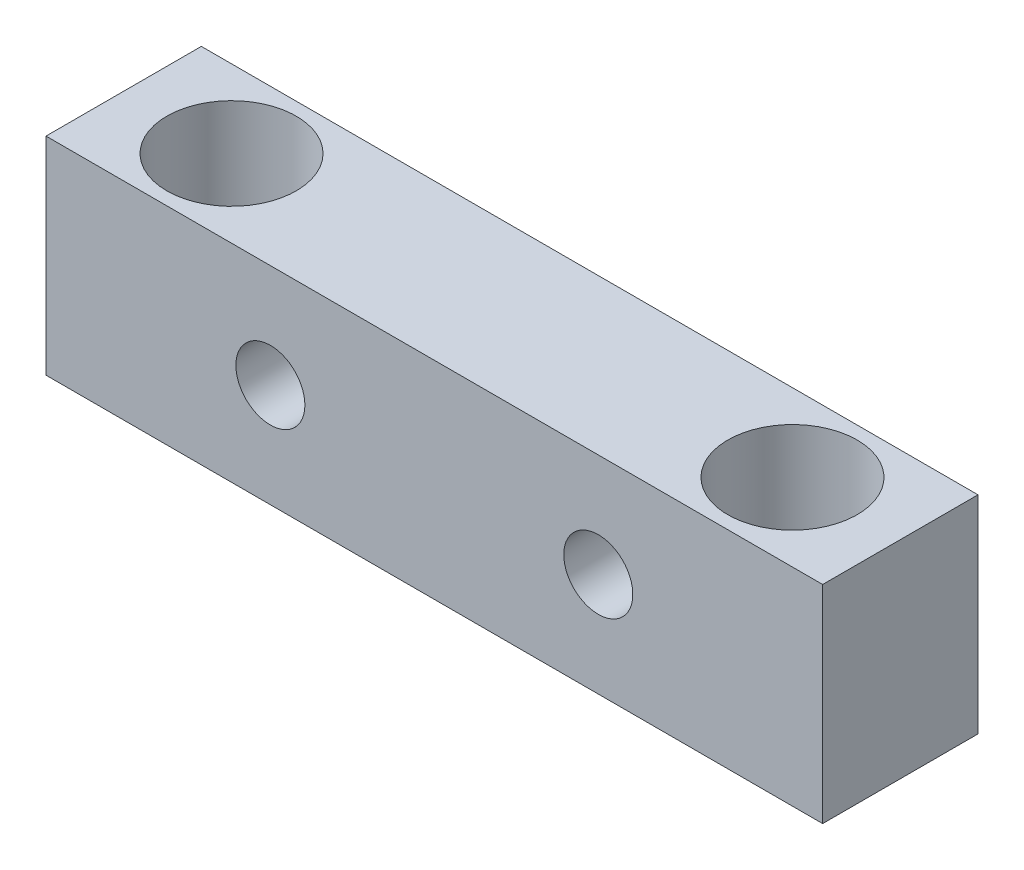
ISO-10303-21;
HEADER;
FILE_DESCRIPTION(('STEP AP214'),'2;1');
FILE_NAME('part.step','',(''),(''),'','','');
FILE_SCHEMA(('AUTOMOTIVE_DESIGN { 1 0 10303 214 1 1 1 1 }'));
ENDSEC;
DATA;
#1=APPLICATION_CONTEXT('core data for automotive mechanical design processes');
#2=APPLICATION_PROTOCOL_DEFINITION('international standard','automotive_design',2000,#1);
#3=PRODUCT_CONTEXT('',#1,'mechanical');
#4=PRODUCT('Part','Part','',(#3));
#5=PRODUCT_RELATED_PRODUCT_CATEGORY('part','',(#4));
#6=PRODUCT_DEFINITION_FORMATION('','',#4);
#7=PRODUCT_DEFINITION_CONTEXT('part definition',#1,'design');
#8=PRODUCT_DEFINITION('design','',#6,#7);
#9=PRODUCT_DEFINITION_SHAPE('','',#8);
#10=(LENGTH_UNIT() NAMED_UNIT(*) SI_UNIT(.MILLI.,.METRE.));
#11=(NAMED_UNIT(*) PLANE_ANGLE_UNIT() SI_UNIT($,.RADIAN.));
#12=(NAMED_UNIT(*) SI_UNIT($,.STERADIAN.) SOLID_ANGLE_UNIT());
#13=UNCERTAINTY_MEASURE_WITH_UNIT(LENGTH_MEASURE(1.E-05),#10,'distance_accuracy_value','');
#14=(GEOMETRIC_REPRESENTATION_CONTEXT(3) GLOBAL_UNCERTAINTY_ASSIGNED_CONTEXT((#13)) GLOBAL_UNIT_ASSIGNED_CONTEXT((#10,
#11,#12)) REPRESENTATION_CONTEXT('',''));
#15=CARTESIAN_POINT('',(0.,0.,0.));
#16=DIRECTION('',(0.,0.,1.));
#17=DIRECTION('',(1.,0.,0.));
#18=AXIS2_PLACEMENT_3D('',#15,#16,#17);
#19=CARTESIAN_POINT('',(0.,0.,9.));
#20=DIRECTION('',(0.,0.,-1.));
#21=DIRECTION('',(-1.,0.,0.));
#22=AXIS2_PLACEMENT_3D('',#19,#20,#21);
#23=PLANE('',#22);
#24=DIRECTION('',(0.,1.,0.));
#25=VECTOR('',#24,1.);
#26=CARTESIAN_POINT('',(45.,-12.,9.));
#27=LINE('',#26,#25);
#28=CARTESIAN_POINT('',(45.,-12.,9.));
#29=VERTEX_POINT('',#28);
#30=CARTESIAN_POINT('',(45.,12.,9.));
#31=VERTEX_POINT('',#30);
#32=EDGE_CURVE('E92',#29,#31,#27,.T.);
#33=ORIENTED_EDGE('',*,*,#32,.T.);
#34=DIRECTION('',(-1.,0.,0.));
#35=VECTOR('',#34,1.);
#36=CARTESIAN_POINT('',(-45.,12.,9.));
#37=LINE('',#36,#35);
#38=CARTESIAN_POINT('',(-45.,12.,9.));
#39=VERTEX_POINT('',#38);
#40=EDGE_CURVE('E87',#31,#39,#37,.T.);
#41=ORIENTED_EDGE('',*,*,#40,.T.);
#42=DIRECTION('',(0.,-1.,0.));
#43=VECTOR('',#42,1.);
#44=CARTESIAN_POINT('',(-45.,-12.,9.));
#45=LINE('',#44,#43);
#46=CARTESIAN_POINT('',(-45.,-12.,9.));
#47=VERTEX_POINT('',#46);
#48=EDGE_CURVE('E90',#39,#47,#45,.T.);
#49=ORIENTED_EDGE('',*,*,#48,.T.);
#50=DIRECTION('',(1.,0.,0.));
#51=VECTOR('',#50,1.);
#52=CARTESIAN_POINT('',(-45.,-12.,9.));
#53=LINE('',#52,#51);
#54=EDGE_CURVE('E57',#47,#29,#53,.T.);
#55=ORIENTED_EDGE('',*,*,#54,.T.);
#56=EDGE_LOOP('',(#33,#41,#49,#55));
#57=FACE_BOUND('',#56,.T.);
#58=CARTESIAN_POINT('',(-19.,0.,9.));
#59=DIRECTION('',(0.,0.,1.));
#60=DIRECTION('',(1.,0.,0.));
#61=AXIS2_PLACEMENT_3D('',#58,#59,#60);
#62=CIRCLE('',#61,4.);
#63=CARTESIAN_POINT('',(-15.,0.,9.));
#64=VERTEX_POINT('',#63);
#65=EDGE_CURVE('E112',#64,#64,#62,.T.);
#66=ORIENTED_EDGE('',*,*,#65,.F.);
#67=EDGE_LOOP('',(#66));
#68=FACE_BOUND('',#67,.T.);
#69=CARTESIAN_POINT('',(19.,0.,9.));
#70=DIRECTION('',(0.,0.,1.));
#71=DIRECTION('',(-1.,0.,0.));
#72=AXIS2_PLACEMENT_3D('',#69,#70,#71);
#73=CIRCLE('',#72,4.);
#74=CARTESIAN_POINT('',(15.,0.,9.));
#75=VERTEX_POINT('',#74);
#76=EDGE_CURVE('E134',#75,#75,#73,.T.);
#77=ORIENTED_EDGE('',*,*,#76,.F.);
#78=EDGE_LOOP('',(#77));
#79=FACE_BOUND('',#78,.T.);
#80=ADVANCED_FACE('F39',(#57,#68,#79),#23,.F.);
#81=CARTESIAN_POINT('',(0.,0.,-9.));
#82=DIRECTION('',(0.,0.,-1.));
#83=DIRECTION('',(-1.,0.,0.));
#84=AXIS2_PLACEMENT_3D('',#81,#82,#83);
#85=PLANE('',#84);
#86=CARTESIAN_POINT('',(-19.,0.,-9.));
#87=DIRECTION('',(0.,0.,1.));
#88=DIRECTION('',(1.,0.,0.));
#89=AXIS2_PLACEMENT_3D('',#86,#87,#88);
#90=CIRCLE('',#89,4.);
#91=CARTESIAN_POINT('',(-15.,0.,-9.));
#92=VERTEX_POINT('',#91);
#93=EDGE_CURVE('E130',#92,#92,#90,.T.);
#94=ORIENTED_EDGE('',*,*,#93,.T.);
#95=EDGE_LOOP('',(#94));
#96=FACE_BOUND('',#95,.T.);
#97=DIRECTION('',(0.,1.,0.));
#98=VECTOR('',#97,1.);
#99=CARTESIAN_POINT('',(45.,-12.,-9.));
#100=LINE('',#99,#98);
#101=CARTESIAN_POINT('',(45.,-12.,-9.));
#102=VERTEX_POINT('',#101);
#103=CARTESIAN_POINT('',(45.,12.,-9.));
#104=VERTEX_POINT('',#103);
#105=EDGE_CURVE('E108',#102,#104,#100,.T.);
#106=ORIENTED_EDGE('',*,*,#105,.F.);
#107=DIRECTION('',(1.,0.,0.));
#108=VECTOR('',#107,1.);
#109=CARTESIAN_POINT('',(-45.,-12.,-9.));
#110=LINE('',#109,#108);
#111=CARTESIAN_POINT('',(-45.,-12.,-9.));
#112=VERTEX_POINT('',#111);
#113=EDGE_CURVE('E80',#112,#102,#110,.T.);
#114=ORIENTED_EDGE('',*,*,#113,.F.);
#115=DIRECTION('',(0.,-1.,0.));
#116=VECTOR('',#115,1.);
#117=CARTESIAN_POINT('',(-45.,-12.,-9.));
#118=LINE('',#117,#116);
#119=CARTESIAN_POINT('',(-45.,12.,-9.));
#120=VERTEX_POINT('',#119);
#121=EDGE_CURVE('E74',#120,#112,#118,.T.);
#122=ORIENTED_EDGE('',*,*,#121,.F.);
#123=DIRECTION('',(-1.,0.,0.));
#124=VECTOR('',#123,1.);
#125=CARTESIAN_POINT('',(-45.,12.,-9.));
#126=LINE('',#125,#124);
#127=EDGE_CURVE('E97',#104,#120,#126,.T.);
#128=ORIENTED_EDGE('',*,*,#127,.F.);
#129=EDGE_LOOP('',(#106,#114,#122,#128));
#130=FACE_BOUND('',#129,.T.);
#131=CARTESIAN_POINT('',(19.,0.,-9.));
#132=DIRECTION('',(0.,0.,1.));
#133=DIRECTION('',(-1.,0.,0.));
#134=AXIS2_PLACEMENT_3D('',#131,#132,#133);
#135=CIRCLE('',#134,4.);
#136=CARTESIAN_POINT('',(15.,0.,-9.));
#137=VERTEX_POINT('',#136);
#138=EDGE_CURVE('E138',#137,#137,#135,.T.);
#139=ORIENTED_EDGE('',*,*,#138,.T.);
#140=EDGE_LOOP('',(#139));
#141=FACE_BOUND('',#140,.T.);
#142=ADVANCED_FACE('F125',(#96,#130,#141),#85,.T.);
#143=CARTESIAN_POINT('',(45.,-12.,9.));
#144=DIRECTION('',(-1.,0.,0.));
#145=DIRECTION('',(0.,0.,1.));
#146=AXIS2_PLACEMENT_3D('',#143,#144,#145);
#147=PLANE('',#146);
#148=ORIENTED_EDGE('',*,*,#105,.T.);
#149=DIRECTION('',(0.,0.,-1.));
#150=VECTOR('',#149,1.);
#151=CARTESIAN_POINT('',(45.,12.,9.));
#152=LINE('',#151,#150);
#153=EDGE_CURVE('E11',#31,#104,#152,.T.);
#154=ORIENTED_EDGE('',*,*,#153,.F.);
#155=ORIENTED_EDGE('',*,*,#32,.F.);
#156=DIRECTION('',(0.,0.,-1.));
#157=VECTOR('',#156,1.);
#158=CARTESIAN_POINT('',(45.,-12.,9.));
#159=LINE('',#158,#157);
#160=EDGE_CURVE('E104',#29,#102,#159,.T.);
#161=ORIENTED_EDGE('',*,*,#160,.T.);
#162=EDGE_LOOP('',(#148,#154,#155,#161));
#163=FACE_BOUND('',#162,.T.);
#164=ADVANCED_FACE('F41',(#163),#147,.F.);
#165=CARTESIAN_POINT('',(-45.,12.,9.));
#166=DIRECTION('',(0.,-1.,0.));
#167=DIRECTION('',(1.,0.,0.));
#168=AXIS2_PLACEMENT_3D('',#165,#166,#167);
#169=PLANE('',#168);
#170=CARTESIAN_POINT('',(-32.5,12.,0.));
#171=DIRECTION('',(0.,1.,0.));
#172=DIRECTION('',(0.,0.,1.));
#173=AXIS2_PLACEMENT_3D('',#170,#171,#172);
#174=CIRCLE('',#173,7.5);
#175=CARTESIAN_POINT('',(-32.5,12.,7.5));
#176=VERTEX_POINT('',#175);
#177=EDGE_CURVE('E154',#176,#176,#174,.T.);
#178=ORIENTED_EDGE('',*,*,#177,.F.);
#179=EDGE_LOOP('',(#178));
#180=FACE_BOUND('',#179,.T.);
#181=CARTESIAN_POINT('',(32.5,12.,0.));
#182=DIRECTION('',(0.,1.,0.));
#183=DIRECTION('',(0.,0.,-1.));
#184=AXIS2_PLACEMENT_3D('',#181,#182,#183);
#185=CIRCLE('',#184,7.5);
#186=CARTESIAN_POINT('',(32.5,12.,-7.50000000000001));
#187=VERTEX_POINT('',#186);
#188=EDGE_CURVE('E146',#187,#187,#185,.T.);
#189=ORIENTED_EDGE('',*,*,#188,.F.);
#190=EDGE_LOOP('',(#189));
#191=FACE_BOUND('',#190,.T.);
#192=ORIENTED_EDGE('',*,*,#127,.T.);
#193=DIRECTION('',(0.,0.,-1.));
#194=VECTOR('',#193,1.);
#195=CARTESIAN_POINT('',(-45.,12.,9.));
#196=LINE('',#195,#194);
#197=EDGE_CURVE('E49',#39,#120,#196,.T.);
#198=ORIENTED_EDGE('',*,*,#197,.F.);
#199=ORIENTED_EDGE('',*,*,#40,.F.);
#200=ORIENTED_EDGE('',*,*,#153,.T.);
#201=EDGE_LOOP('',(#192,#198,#199,#200));
#202=FACE_BOUND('',#201,.T.);
#203=ADVANCED_FACE('F96',(#180,#191,#202),#169,.F.);
#204=CARTESIAN_POINT('',(-45.,-12.,9.));
#205=DIRECTION('',(1.,0.,0.));
#206=DIRECTION('',(0.,0.,-1.));
#207=AXIS2_PLACEMENT_3D('',#204,#205,#206);
#208=PLANE('',#207);
#209=ORIENTED_EDGE('',*,*,#121,.T.);
#210=DIRECTION('',(0.,0.,-1.));
#211=VECTOR('',#210,1.);
#212=CARTESIAN_POINT('',(-45.,-12.,9.));
#213=LINE('',#212,#211);
#214=EDGE_CURVE('E99',#47,#112,#213,.T.);
#215=ORIENTED_EDGE('',*,*,#214,.F.);
#216=ORIENTED_EDGE('',*,*,#48,.F.);
#217=ORIENTED_EDGE('',*,*,#197,.T.);
#218=EDGE_LOOP('',(#209,#215,#216,#217));
#219=FACE_BOUND('',#218,.T.);
#220=ADVANCED_FACE('F100',(#219),#208,.F.);
#221=CARTESIAN_POINT('',(-45.,-12.,9.));
#222=DIRECTION('',(0.,1.,0.));
#223=DIRECTION('',(0.,0.,1.));
#224=AXIS2_PLACEMENT_3D('',#221,#222,#223);
#225=PLANE('',#224);
#226=CARTESIAN_POINT('',(-32.5,-12.,0.));
#227=DIRECTION('',(0.,1.,0.));
#228=DIRECTION('',(0.,0.,1.));
#229=AXIS2_PLACEMENT_3D('',#226,#227,#228);
#230=CIRCLE('',#229,7.5);
#231=CARTESIAN_POINT('',(-32.5,-12.,7.5));
#232=VERTEX_POINT('',#231);
#233=EDGE_CURVE('E142',#232,#232,#230,.T.);
#234=ORIENTED_EDGE('',*,*,#233,.T.);
#235=EDGE_LOOP('',(#234));
#236=FACE_BOUND('',#235,.T.);
#237=CARTESIAN_POINT('',(32.5,-12.,0.));
#238=DIRECTION('',(0.,1.,0.));
#239=DIRECTION('',(0.,0.,-1.));
#240=AXIS2_PLACEMENT_3D('',#237,#238,#239);
#241=CIRCLE('',#240,7.5);
#242=CARTESIAN_POINT('',(32.5,-12.,-7.50000000000001));
#243=VERTEX_POINT('',#242);
#244=EDGE_CURVE('E150',#243,#243,#241,.T.);
#245=ORIENTED_EDGE('',*,*,#244,.T.);
#246=EDGE_LOOP('',(#245));
#247=FACE_BOUND('',#246,.T.);
#248=ORIENTED_EDGE('',*,*,#113,.T.);
#249=ORIENTED_EDGE('',*,*,#160,.F.);
#250=ORIENTED_EDGE('',*,*,#54,.F.);
#251=ORIENTED_EDGE('',*,*,#214,.T.);
#252=EDGE_LOOP('',(#248,#249,#250,#251));
#253=FACE_BOUND('',#252,.T.);
#254=ADVANCED_FACE('F122',(#236,#247,#253),#225,.F.);
#255=CARTESIAN_POINT('',(-19.,0.,9.));
#256=DIRECTION('',(0.,0.,-1.));
#257=DIRECTION('',(-1.,0.,0.));
#258=AXIS2_PLACEMENT_3D('',#255,#256,#257);
#259=CYLINDRICAL_SURFACE('',#258,4.);
#260=ORIENTED_EDGE('',*,*,#65,.T.);
#261=EDGE_LOOP('',(#260));
#262=FACE_BOUND('',#261,.T.);
#263=ORIENTED_EDGE('',*,*,#93,.F.);
#264=EDGE_LOOP('',(#263));
#265=FACE_BOUND('',#264,.T.);
#266=ADVANCED_FACE('F182',(#262,#265),#259,.F.);
#267=CARTESIAN_POINT('',(19.,0.,9.));
#268=DIRECTION('',(0.,0.,-1.));
#269=DIRECTION('',(-1.,0.,0.));
#270=AXIS2_PLACEMENT_3D('',#267,#268,#269);
#271=CYLINDRICAL_SURFACE('',#270,4.);
#272=ORIENTED_EDGE('',*,*,#76,.T.);
#273=EDGE_LOOP('',(#272));
#274=FACE_BOUND('',#273,.T.);
#275=ORIENTED_EDGE('',*,*,#138,.F.);
#276=EDGE_LOOP('',(#275));
#277=FACE_BOUND('',#276,.T.);
#278=ADVANCED_FACE('F176',(#274,#277),#271,.F.);
#279=CARTESIAN_POINT('',(32.5,-12.,0.));
#280=DIRECTION('',(0.,1.,0.));
#281=DIRECTION('',(0.,0.,1.));
#282=AXIS2_PLACEMENT_3D('',#279,#280,#281);
#283=CYLINDRICAL_SURFACE('',#282,7.5);
#284=ORIENTED_EDGE('',*,*,#244,.F.);
#285=EDGE_LOOP('',(#284));
#286=FACE_BOUND('',#285,.T.);
#287=ORIENTED_EDGE('',*,*,#188,.T.);
#288=EDGE_LOOP('',(#287));
#289=FACE_BOUND('',#288,.T.);
#290=ADVANCED_FACE('F167',(#286,#289),#283,.F.);
#291=CARTESIAN_POINT('',(-32.5,-12.,0.));
#292=DIRECTION('',(0.,1.,0.));
#293=DIRECTION('',(0.,0.,1.));
#294=AXIS2_PLACEMENT_3D('',#291,#292,#293);
#295=CYLINDRICAL_SURFACE('',#294,7.5);
#296=ORIENTED_EDGE('',*,*,#233,.F.);
#297=EDGE_LOOP('',(#296));
#298=FACE_BOUND('',#297,.T.);
#299=ORIENTED_EDGE('',*,*,#177,.T.);
#300=EDGE_LOOP('',(#299));
#301=FACE_BOUND('',#300,.T.);
#302=ADVANCED_FACE('F164',(#298,#301),#295,.F.);
#303=CLOSED_SHELL('',(#80,#142,#164,#203,#220,#254,#266,#278,#290,#302));
#304=MANIFOLD_SOLID_BREP('B2',#303);
#305=ADVANCED_BREP_SHAPE_REPRESENTATION('',(#18,#304),#14);
#306=SHAPE_DEFINITION_REPRESENTATION(#9,#305);
ENDSEC;
END-ISO-10303-21;
